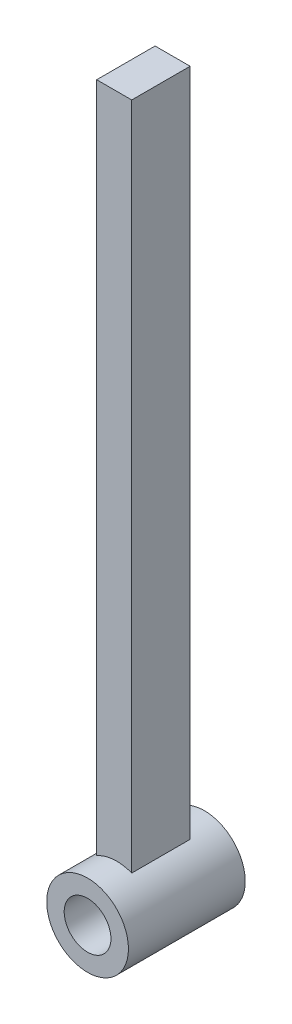
ISO-10303-21;
HEADER;
FILE_DESCRIPTION(('STEP AP214'),'2;1');
FILE_NAME('part.step','',(''),(''),'','','');
FILE_SCHEMA(('AUTOMOTIVE_DESIGN { 1 0 10303 214 1 1 1 1 }'));
ENDSEC;
DATA;
#1=APPLICATION_CONTEXT('core data for automotive mechanical design processes');
#2=APPLICATION_PROTOCOL_DEFINITION('international standard','automotive_design',2000,#1);
#3=PRODUCT_CONTEXT('',#1,'mechanical');
#4=PRODUCT('Part','Part','',(#3));
#5=PRODUCT_RELATED_PRODUCT_CATEGORY('part','',(#4));
#6=PRODUCT_DEFINITION_FORMATION('','',#4);
#7=PRODUCT_DEFINITION_CONTEXT('part definition',#1,'design');
#8=PRODUCT_DEFINITION('design','',#6,#7);
#9=PRODUCT_DEFINITION_SHAPE('','',#8);
#10=(LENGTH_UNIT() NAMED_UNIT(*) SI_UNIT(.MILLI.,.METRE.));
#11=(NAMED_UNIT(*) PLANE_ANGLE_UNIT() SI_UNIT($,.RADIAN.));
#12=(NAMED_UNIT(*) SI_UNIT($,.STERADIAN.) SOLID_ANGLE_UNIT());
#13=UNCERTAINTY_MEASURE_WITH_UNIT(LENGTH_MEASURE(1.E-05),#10,'distance_accuracy_value','');
#14=(GEOMETRIC_REPRESENTATION_CONTEXT(3) GLOBAL_UNCERTAINTY_ASSIGNED_CONTEXT((#13)) GLOBAL_UNIT_ASSIGNED_CONTEXT((#10,
#11,#12)) REPRESENTATION_CONTEXT('',''));
#15=CARTESIAN_POINT('',(0.,0.,0.));
#16=DIRECTION('',(0.,0.,1.));
#17=DIRECTION('',(1.,0.,0.));
#18=AXIS2_PLACEMENT_3D('',#15,#16,#17);
#19=CARTESIAN_POINT('',(3.,55.,2.5));
#20=DIRECTION('',(-1.,0.,0.));
#21=DIRECTION('',(0.,-1.,0.));
#22=AXIS2_PLACEMENT_3D('',#19,#20,#21);
#23=PLANE('',#22);
#24=DIRECTION('',(0.,1.,0.));
#25=VECTOR('',#24,1.);
#26=CARTESIAN_POINT('',(3.,55.,-2.5));
#27=LINE('',#26,#25);
#28=CARTESIAN_POINT('',(3.00000000000001,-2.32513972877606,-2.5));
#29=VERTEX_POINT('',#28);
#30=CARTESIAN_POINT('',(3.,55.,-2.5));
#31=VERTEX_POINT('',#30);
#32=EDGE_CURVE('E61',#29,#31,#27,.T.);
#33=ORIENTED_EDGE('',*,*,#32,.T.);
#34=DIRECTION('',(0.,0.,-1.));
#35=VECTOR('',#34,1.);
#36=CARTESIAN_POINT('',(3.,55.,2.5));
#37=LINE('',#36,#35);
#38=CARTESIAN_POINT('',(3.,55.,2.5));
#39=VERTEX_POINT('',#38);
#40=EDGE_CURVE('E11',#39,#31,#37,.T.);
#41=ORIENTED_EDGE('',*,*,#40,.F.);
#42=DIRECTION('',(0.,1.,0.));
#43=VECTOR('',#42,1.);
#44=CARTESIAN_POINT('',(3.,55.,2.5));
#45=LINE('',#44,#43);
#46=CARTESIAN_POINT('',(3.00000000000001,-2.32513972877606,2.5));
#47=VERTEX_POINT('',#46);
#48=EDGE_CURVE('E79',#47,#39,#45,.T.);
#49=ORIENTED_EDGE('',*,*,#48,.F.);
#50=DIRECTION('',(0.,0.,-1.));
#51=VECTOR('',#50,1.);
#52=CARTESIAN_POINT('',(3.00000000000001,-2.32513972877606,5.));
#53=LINE('',#52,#51);
#54=EDGE_CURVE('E78',#29,#47,#53,.F.);
#55=ORIENTED_EDGE('',*,*,#54,.F.);
#56=EDGE_LOOP('',(#33,#41,#49,#55));
#57=FACE_BOUND('',#56,.T.);
#58=ADVANCED_FACE('F34',(#57),#23,.F.);
#59=CARTESIAN_POINT('',(0.,55.,2.5));
#60=DIRECTION('',(0.,-1.,0.));
#61=DIRECTION('',(0.,0.,-1.));
#62=AXIS2_PLACEMENT_3D('',#59,#60,#61);
#63=PLANE('',#62);
#64=DIRECTION('',(-1.,0.,0.));
#65=VECTOR('',#64,1.);
#66=CARTESIAN_POINT('',(0.,55.,-2.5));
#67=LINE('',#66,#65);
#68=CARTESIAN_POINT('',(0.,55.,-2.5));
#69=VERTEX_POINT('',#68);
#70=EDGE_CURVE('E91',#31,#69,#67,.T.);
#71=ORIENTED_EDGE('',*,*,#70,.T.);
#72=DIRECTION('',(0.,0.,-1.));
#73=VECTOR('',#72,1.);
#74=CARTESIAN_POINT('',(0.,55.,2.5));
#75=LINE('',#74,#73);
#76=CARTESIAN_POINT('',(0.,55.,2.5));
#77=VERTEX_POINT('',#76);
#78=EDGE_CURVE('E42',#77,#69,#75,.T.);
#79=ORIENTED_EDGE('',*,*,#78,.F.);
#80=DIRECTION('',(-1.,0.,0.));
#81=VECTOR('',#80,1.);
#82=CARTESIAN_POINT('',(0.,55.,2.5));
#83=LINE('',#82,#81);
#84=EDGE_CURVE('E50',#39,#77,#83,.T.);
#85=ORIENTED_EDGE('',*,*,#84,.F.);
#86=ORIENTED_EDGE('',*,*,#40,.T.);
#87=EDGE_LOOP('',(#71,#79,#85,#86));
#88=FACE_BOUND('',#87,.T.);
#89=ADVANCED_FACE('F107',(#88),#63,.F.);
#90=CARTESIAN_POINT('',(0.,0.,2.5));
#91=DIRECTION('',(1.,0.,0.));
#92=DIRECTION('',(0.,0.,-1.));
#93=AXIS2_PLACEMENT_3D('',#90,#91,#92);
#94=PLANE('',#93);
#95=DIRECTION('',(0.,-1.,0.));
#96=VECTOR('',#95,1.);
#97=CARTESIAN_POINT('',(0.,0.,-2.5));
#98=LINE('',#97,#96);
#99=CARTESIAN_POINT('',(0.,-2.53319691657608,-2.5));
#100=VERTEX_POINT('',#99);
#101=EDGE_CURVE('E69',#69,#100,#98,.T.);
#102=ORIENTED_EDGE('',*,*,#101,.T.);
#103=DIRECTION('',(0.,0.,-1.));
#104=VECTOR('',#103,1.);
#105=CARTESIAN_POINT('',(0.,-2.53319691657608,5.));
#106=LINE('',#105,#104);
#107=CARTESIAN_POINT('',(0.,-2.53319691657608,2.5));
#108=VERTEX_POINT('',#107);
#109=EDGE_CURVE('E92',#108,#100,#106,.T.);
#110=ORIENTED_EDGE('',*,*,#109,.F.);
#111=DIRECTION('',(0.,-1.,0.));
#112=VECTOR('',#111,1.);
#113=CARTESIAN_POINT('',(0.,0.,2.5));
#114=LINE('',#113,#112);
#115=EDGE_CURVE('E101',#77,#108,#114,.T.);
#116=ORIENTED_EDGE('',*,*,#115,.F.);
#117=ORIENTED_EDGE('',*,*,#78,.T.);
#118=EDGE_LOOP('',(#102,#110,#116,#117));
#119=FACE_BOUND('',#118,.T.);
#120=ADVANCED_FACE('F105',(#119),#94,.F.);
#121=CARTESIAN_POINT('',(0.,0.,2.5));
#122=DIRECTION('',(0.,0.,-1.));
#123=DIRECTION('',(-1.,0.,0.));
#124=AXIS2_PLACEMENT_3D('',#121,#122,#123);
#125=PLANE('',#124);
#126=ORIENTED_EDGE('',*,*,#115,.T.);
#127=CARTESIAN_POINT('',(1.71866759336536,-5.58216095432984,2.5));
#128=DIRECTION('',(0.,0.,-1.));
#129=DIRECTION('',(-1.,0.,0.));
#130=AXIS2_PLACEMENT_3D('',#127,#128,#129);
#131=CIRCLE('',#130,3.5);
#132=EDGE_CURVE('E85',#47,#108,#131,.F.);
#133=ORIENTED_EDGE('',*,*,#132,.F.);
#134=ORIENTED_EDGE('',*,*,#48,.T.);
#135=ORIENTED_EDGE('',*,*,#84,.T.);
#136=EDGE_LOOP('',(#126,#133,#134,#135));
#137=FACE_BOUND('',#136,.T.);
#138=ADVANCED_FACE('F113',(#137),#125,.F.);
#139=CARTESIAN_POINT('',(0.,0.,-2.5));
#140=DIRECTION('',(0.,0.,-1.));
#141=DIRECTION('',(-1.,0.,0.));
#142=AXIS2_PLACEMENT_3D('',#139,#140,#141);
#143=PLANE('',#142);
#144=ORIENTED_EDGE('',*,*,#32,.F.);
#145=CARTESIAN_POINT('',(1.71866759336536,-5.58216095432984,-2.5));
#146=DIRECTION('',(0.,0.,1.));
#147=DIRECTION('',(1.,0.,0.));
#148=AXIS2_PLACEMENT_3D('',#145,#146,#147);
#149=CIRCLE('',#148,3.5);
#150=EDGE_CURVE('E84',#100,#29,#149,.F.);
#151=ORIENTED_EDGE('',*,*,#150,.F.);
#152=ORIENTED_EDGE('',*,*,#101,.F.);
#153=ORIENTED_EDGE('',*,*,#70,.F.);
#154=EDGE_LOOP('',(#144,#151,#152,#153));
#155=FACE_BOUND('',#154,.T.);
#156=ADVANCED_FACE('F89',(#155),#143,.T.);
#157=CARTESIAN_POINT('',(1.71866759336536,-5.58216095432984,5.));
#158=DIRECTION('',(0.,0.,-1.));
#159=DIRECTION('',(-1.,0.,0.));
#160=AXIS2_PLACEMENT_3D('',#157,#158,#159);
#161=CYLINDRICAL_SURFACE('',#160,3.5);
#162=CARTESIAN_POINT('',(1.71866759336536,-5.58216095432984,-5.));
#163=DIRECTION('',(0.,0.,1.));
#164=DIRECTION('',(1.,0.,0.));
#165=AXIS2_PLACEMENT_3D('',#162,#163,#164);
#166=CIRCLE('',#165,3.5);
#167=CARTESIAN_POINT('',(5.21866759336536,-5.58216095432984,-5.));
#168=VERTEX_POINT('',#167);
#169=EDGE_CURVE('E145',#168,#168,#166,.T.);
#170=ORIENTED_EDGE('',*,*,#169,.T.);
#171=EDGE_LOOP('',(#170));
#172=FACE_BOUND('',#171,.T.);
#173=CARTESIAN_POINT('',(1.71866759336536,-5.58216095432984,5.));
#174=DIRECTION('',(0.,0.,1.));
#175=DIRECTION('',(1.,0.,0.));
#176=AXIS2_PLACEMENT_3D('',#173,#174,#175);
#177=CIRCLE('',#176,3.5);
#178=CARTESIAN_POINT('',(5.21866759336536,-5.58216095432984,5.));
#179=VERTEX_POINT('',#178);
#180=EDGE_CURVE('E148',#179,#179,#177,.T.);
#181=ORIENTED_EDGE('',*,*,#180,.F.);
#182=EDGE_LOOP('',(#181));
#183=FACE_BOUND('',#182,.T.);
#184=ORIENTED_EDGE('',*,*,#54,.T.);
#185=ORIENTED_EDGE('',*,*,#132,.T.);
#186=ORIENTED_EDGE('',*,*,#109,.T.);
#187=ORIENTED_EDGE('',*,*,#150,.T.);
#188=EDGE_LOOP('',(#184,#185,#186,#187));
#189=FACE_BOUND('',#188,.T.);
#190=ADVANCED_FACE('F94',(#172,#183,#189),#161,.T.);
#191=CARTESIAN_POINT('',(1.71866759336536,-5.58216095432984,5.));
#192=DIRECTION('',(0.,0.,1.));
#193=DIRECTION('',(1.,0.,0.));
#194=AXIS2_PLACEMENT_3D('',#191,#192,#193);
#195=PLANE('',#194);
#196=ORIENTED_EDGE('',*,*,#180,.T.);
#197=EDGE_LOOP('',(#196));
#198=FACE_BOUND('',#197,.T.);
#199=CARTESIAN_POINT('',(1.71866759336536,-5.58216095432984,5.));
#200=DIRECTION('',(0.,0.,1.));
#201=DIRECTION('',(1.,0.,0.));
#202=AXIS2_PLACEMENT_3D('',#199,#200,#201);
#203=CIRCLE('',#202,2.);
#204=CARTESIAN_POINT('',(3.71866759336536,-5.58216095432984,5.));
#205=VERTEX_POINT('',#204);
#206=EDGE_CURVE('E139',#205,#205,#203,.T.);
#207=ORIENTED_EDGE('',*,*,#206,.F.);
#208=EDGE_LOOP('',(#207));
#209=FACE_BOUND('',#208,.T.);
#210=ADVANCED_FACE('F122',(#198,#209),#195,.T.);
#211=CARTESIAN_POINT('',(1.71866759336536,-5.58216095432984,-5.));
#212=DIRECTION('',(0.,0.,1.));
#213=DIRECTION('',(1.,0.,0.));
#214=AXIS2_PLACEMENT_3D('',#211,#212,#213);
#215=PLANE('',#214);
#216=ORIENTED_EDGE('',*,*,#169,.F.);
#217=EDGE_LOOP('',(#216));
#218=FACE_BOUND('',#217,.T.);
#219=CARTESIAN_POINT('',(1.71866759336536,-5.58216095432984,-5.));
#220=DIRECTION('',(0.,0.,1.));
#221=DIRECTION('',(1.,0.,0.));
#222=AXIS2_PLACEMENT_3D('',#219,#220,#221);
#223=CIRCLE('',#222,2.);
#224=CARTESIAN_POINT('',(3.71866759336536,-5.58216095432984,-5.));
#225=VERTEX_POINT('',#224);
#226=EDGE_CURVE('E142',#225,#225,#223,.T.);
#227=ORIENTED_EDGE('',*,*,#226,.T.);
#228=EDGE_LOOP('',(#227));
#229=FACE_BOUND('',#228,.T.);
#230=ADVANCED_FACE('F124',(#218,#229),#215,.F.);
#231=CARTESIAN_POINT('',(1.71866759336536,-5.58216095432984,5.));
#232=DIRECTION('',(0.,0.,-1.));
#233=DIRECTION('',(-1.,0.,0.));
#234=AXIS2_PLACEMENT_3D('',#231,#232,#233);
#235=CYLINDRICAL_SURFACE('',#234,2.);
#236=ORIENTED_EDGE('',*,*,#206,.T.);
#237=EDGE_LOOP('',(#236));
#238=FACE_BOUND('',#237,.T.);
#239=ORIENTED_EDGE('',*,*,#226,.F.);
#240=EDGE_LOOP('',(#239));
#241=FACE_BOUND('',#240,.T.);
#242=ADVANCED_FACE('F127',(#238,#241),#235,.F.);
#243=CLOSED_SHELL('',(#58,#89,#120,#138,#156,#190,#210,#230,#242));
#244=MANIFOLD_SOLID_BREP('B2',#243);
#245=ADVANCED_BREP_SHAPE_REPRESENTATION('',(#18,#244),#14);
#246=SHAPE_DEFINITION_REPRESENTATION(#9,#245);
ENDSEC;
END-ISO-10303-21;
